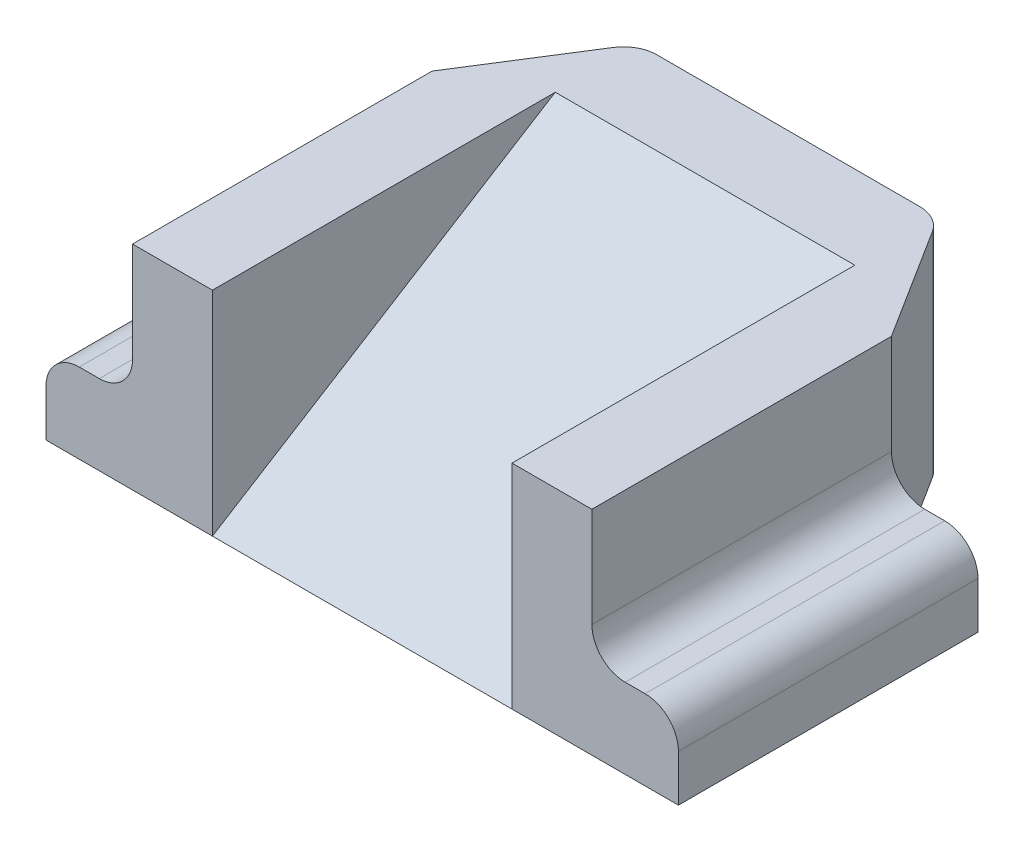
ISO-10303-21;
HEADER;
FILE_DESCRIPTION(('STEP AP214'),'2;1');
FILE_NAME('part.step','',(''),(''),'','','');
FILE_SCHEMA(('AUTOMOTIVE_DESIGN { 1 0 10303 214 1 1 1 1 }'));
ENDSEC;
DATA;
#1=APPLICATION_CONTEXT('core data for automotive mechanical design processes');
#2=APPLICATION_PROTOCOL_DEFINITION('international standard','automotive_design',2000,#1);
#3=PRODUCT_CONTEXT('',#1,'mechanical');
#4=PRODUCT('Part','Part','',(#3));
#5=PRODUCT_RELATED_PRODUCT_CATEGORY('part','',(#4));
#6=PRODUCT_DEFINITION_FORMATION('','',#4);
#7=PRODUCT_DEFINITION_CONTEXT('part definition',#1,'design');
#8=PRODUCT_DEFINITION('design','',#6,#7);
#9=PRODUCT_DEFINITION_SHAPE('','',#8);
#10=(LENGTH_UNIT() NAMED_UNIT(*) SI_UNIT(.MILLI.,.METRE.));
#11=(NAMED_UNIT(*) PLANE_ANGLE_UNIT() SI_UNIT($,.RADIAN.));
#12=(NAMED_UNIT(*) SI_UNIT($,.STERADIAN.) SOLID_ANGLE_UNIT());
#13=UNCERTAINTY_MEASURE_WITH_UNIT(LENGTH_MEASURE(1.E-05),#10,'distance_accuracy_value','');
#14=(GEOMETRIC_REPRESENTATION_CONTEXT(3) GLOBAL_UNCERTAINTY_ASSIGNED_CONTEXT((#13)) GLOBAL_UNIT_ASSIGNED_CONTEXT((#10,
#11,#12)) REPRESENTATION_CONTEXT('',''));
#15=CARTESIAN_POINT('',(0.,0.,0.));
#16=DIRECTION('',(0.,0.,1.));
#17=DIRECTION('',(1.,0.,0.));
#18=AXIS2_PLACEMENT_3D('',#15,#16,#17);
#19=CARTESIAN_POINT('',(26.,64.,-128.));
#20=DIRECTION('',(0.,-1.,0.));
#21=DIRECTION('',(0.,0.,-1.));
#22=AXIS2_PLACEMENT_3D('',#19,#20,#21);
#23=PLANE('',#22);
#24=DIRECTION('',(0.533992991387982,0.,0.845488903030971));
#25=VECTOR('',#24,1.);
#26=CARTESIAN_POINT('',(164.,64.,-90.));
#27=LINE('',#26,#25);
#28=CARTESIAN_POINT('',(142.943202159655,64.,-123.33992991388));
#29=VERTEX_POINT('',#28);
#30=CARTESIAN_POINT('',(164.,64.,-90.));
#31=VERTEX_POINT('',#30);
#32=EDGE_CURVE('E331',#29,#31,#27,.T.);
#33=ORIENTED_EDGE('',*,*,#32,.F.);
#34=CARTESIAN_POINT('',(134.488313129345,64.,-118.));
#35=DIRECTION('',(0.,-1.,0.));
#36=DIRECTION('',(0.,0.,-1.));
#37=AXIS2_PLACEMENT_3D('',#34,#35,#36);
#38=CIRCLE('',#37,10.);
#39=CARTESIAN_POINT('',(134.488313129345,64.,-128.));
#40=VERTEX_POINT('',#39);
#41=EDGE_CURVE('E233',#29,#40,#38,.F.);
#42=ORIENTED_EDGE('',*,*,#41,.T.);
#43=DIRECTION('',(1.,0.,0.));
#44=VECTOR('',#43,1.);
#45=CARTESIAN_POINT('',(26.,64.,-128.));
#46=LINE('',#45,#44);
#47=CARTESIAN_POINT('',(55.5116868706548,64.,-128.));
#48=VERTEX_POINT('',#47);
#49=EDGE_CURVE('E213',#48,#40,#46,.T.);
#50=ORIENTED_EDGE('',*,*,#49,.F.);
#51=CARTESIAN_POINT('',(55.5116868706548,64.,-118.));
#52=DIRECTION('',(0.,-1.,0.));
#53=DIRECTION('',(0.,0.,-1.));
#54=AXIS2_PLACEMENT_3D('',#51,#52,#53);
#55=CIRCLE('',#54,10.);
#56=CARTESIAN_POINT('',(47.0567978403451,64.,-123.33992991388));
#57=VERTEX_POINT('',#56);
#58=EDGE_CURVE('E231',#48,#57,#55,.F.);
#59=ORIENTED_EDGE('',*,*,#58,.T.);
#60=DIRECTION('',(0.533992991387981,0.,-0.845488903030971));
#61=VECTOR('',#60,1.);
#62=CARTESIAN_POINT('',(26.,64.,-90.));
#63=LINE('',#62,#61);
#64=CARTESIAN_POINT('',(26.,64.,-90.));
#65=VERTEX_POINT('',#64);
#66=EDGE_CURVE('E343',#65,#57,#63,.T.);
#67=ORIENTED_EDGE('',*,*,#66,.F.);
#68=DIRECTION('',(0.,0.,1.));
#69=VECTOR('',#68,1.);
#70=CARTESIAN_POINT('',(26.,64.,-128.));
#71=LINE('',#70,#69);
#72=CARTESIAN_POINT('',(26.,64.,0.));
#73=VERTEX_POINT('',#72);
#74=EDGE_CURVE('E191',#65,#73,#71,.T.);
#75=ORIENTED_EDGE('',*,*,#74,.T.);
#76=DIRECTION('',(1.,0.,0.));
#77=VECTOR('',#76,1.);
#78=CARTESIAN_POINT('',(26.,64.,0.));
#79=LINE('',#78,#77);
#80=CARTESIAN_POINT('',(50.,64.,0.));
#81=VERTEX_POINT('',#80);
#82=EDGE_CURVE('E181',#73,#81,#79,.T.);
#83=ORIENTED_EDGE('',*,*,#82,.T.);
#84=DIRECTION('',(0.,0.,-1.));
#85=VECTOR('',#84,1.);
#86=CARTESIAN_POINT('',(50.,64.,0.));
#87=LINE('',#86,#85);
#88=CARTESIAN_POINT('',(50.,64.,-103.));
#89=VERTEX_POINT('',#88);
#90=EDGE_CURVE('E163',#81,#89,#87,.T.);
#91=ORIENTED_EDGE('',*,*,#90,.T.);
#92=DIRECTION('',(1.,0.,0.));
#93=VECTOR('',#92,1.);
#94=CARTESIAN_POINT('',(50.,64.,-103.));
#95=LINE('',#94,#93);
#96=CARTESIAN_POINT('',(140.,64.,-103.));
#97=VERTEX_POINT('',#96);
#98=EDGE_CURVE('E334',#89,#97,#95,.T.);
#99=ORIENTED_EDGE('',*,*,#98,.T.);
#100=DIRECTION('',(0.,0.,1.));
#101=VECTOR('',#100,1.);
#102=CARTESIAN_POINT('',(140.,64.,-103.));
#103=LINE('',#102,#101);
#104=CARTESIAN_POINT('',(140.,64.,0.));
#105=VERTEX_POINT('',#104);
#106=EDGE_CURVE('E173',#97,#105,#103,.T.);
#107=ORIENTED_EDGE('',*,*,#106,.T.);
#108=CARTESIAN_POINT('',(164.,64.,0.));
#109=VERTEX_POINT('',#108);
#110=EDGE_CURVE('E193',#105,#109,#79,.T.);
#111=ORIENTED_EDGE('',*,*,#110,.T.);
#112=DIRECTION('',(0.,0.,1.));
#113=VECTOR('',#112,1.);
#114=CARTESIAN_POINT('',(164.,64.,-128.));
#115=LINE('',#114,#113);
#116=EDGE_CURVE('E221',#31,#109,#115,.T.);
#117=ORIENTED_EDGE('',*,*,#116,.F.);
#118=EDGE_LOOP('',(#33,#42,#50,#59,#67,#75,#83,#91,#99,#107,#111,#117));
#119=FACE_BOUND('',#118,.T.);
#120=ADVANCED_FACE('F33',(#119),#23,.F.);
#121=CARTESIAN_POINT('',(0.,0.,0.));
#122=DIRECTION('',(0.,0.,-1.));
#123=DIRECTION('',(-1.,0.,0.));
#124=AXIS2_PLACEMENT_3D('',#121,#122,#123);
#125=PLANE('',#124);
#126=DIRECTION('',(0.,-1.,0.));
#127=VECTOR('',#126,1.);
#128=CARTESIAN_POINT('',(190.,24.,0.));
#129=LINE('',#128,#127);
#130=CARTESIAN_POINT('',(190.,14.,0.));
#131=VERTEX_POINT('',#130);
#132=CARTESIAN_POINT('',(190.,0.,0.));
#133=VERTEX_POINT('',#132);
#134=EDGE_CURVE('E204',#131,#133,#129,.T.);
#135=ORIENTED_EDGE('',*,*,#134,.F.);
#136=CARTESIAN_POINT('',(180.,14.,0.));
#137=DIRECTION('',(0.,0.,-1.));
#138=DIRECTION('',(-1.,0.,0.));
#139=AXIS2_PLACEMENT_3D('',#136,#137,#138);
#140=CIRCLE('',#139,10.);
#141=CARTESIAN_POINT('',(180.,24.,0.));
#142=VERTEX_POINT('',#141);
#143=EDGE_CURVE('E271',#131,#142,#140,.F.);
#144=ORIENTED_EDGE('',*,*,#143,.T.);
#145=DIRECTION('',(-1.,0.,0.));
#146=VECTOR('',#145,1.);
#147=CARTESIAN_POINT('',(190.,24.,0.));
#148=LINE('',#147,#146);
#149=CARTESIAN_POINT('',(174.,24.,0.));
#150=VERTEX_POINT('',#149);
#151=EDGE_CURVE('E195',#142,#150,#148,.T.);
#152=ORIENTED_EDGE('',*,*,#151,.T.);
#153=CARTESIAN_POINT('',(174.,34.,0.));
#154=DIRECTION('',(0.,0.,-1.));
#155=DIRECTION('',(-1.,0.,0.));
#156=AXIS2_PLACEMENT_3D('',#153,#154,#155);
#157=CIRCLE('',#156,10.);
#158=CARTESIAN_POINT('',(164.,34.,0.));
#159=VERTEX_POINT('',#158);
#160=EDGE_CURVE('E42',#150,#159,#157,.T.);
#161=ORIENTED_EDGE('',*,*,#160,.T.);
#162=DIRECTION('',(0.,1.,0.));
#163=VECTOR('',#162,1.);
#164=CARTESIAN_POINT('',(164.,24.,0.));
#165=LINE('',#164,#163);
#166=EDGE_CURVE('E192',#159,#109,#165,.T.);
#167=ORIENTED_EDGE('',*,*,#166,.T.);
#168=ORIENTED_EDGE('',*,*,#110,.F.);
#169=DIRECTION('',(0.,1.,0.));
#170=VECTOR('',#169,1.);
#171=CARTESIAN_POINT('',(140.,-116.907978850755,0.));
#172=LINE('',#171,#170);
#173=CARTESIAN_POINT('',(140.,0.,0.));
#174=VERTEX_POINT('',#173);
#175=EDGE_CURVE('E185',#174,#105,#172,.T.);
#176=ORIENTED_EDGE('',*,*,#175,.F.);
#177=DIRECTION('',(1.,0.,0.));
#178=VECTOR('',#177,1.);
#179=CARTESIAN_POINT('',(0.,0.,0.));
#180=LINE('',#179,#178);
#181=EDGE_CURVE('E206',#174,#133,#180,.T.);
#182=ORIENTED_EDGE('',*,*,#181,.T.);
#183=EDGE_LOOP('',(#135,#144,#152,#161,#167,#168,#176,#182));
#184=FACE_BOUND('',#183,.T.);
#185=ADVANCED_FACE('F282',(#184),#125,.F.);
#186=DIRECTION('',(1.,0.,0.));
#187=VECTOR('',#186,1.);
#188=CARTESIAN_POINT('',(0.,24.,0.));
#189=LINE('',#188,#187);
#190=CARTESIAN_POINT('',(10.,24.,0.));
#191=VERTEX_POINT('',#190);
#192=CARTESIAN_POINT('',(16.,24.,0.));
#193=VERTEX_POINT('',#192);
#194=EDGE_CURVE('E210',#191,#193,#189,.T.);
#195=ORIENTED_EDGE('',*,*,#194,.F.);
#196=CARTESIAN_POINT('',(10.,14.,0.));
#197=DIRECTION('',(0.,0.,-1.));
#198=DIRECTION('',(-1.,0.,0.));
#199=AXIS2_PLACEMENT_3D('',#196,#197,#198);
#200=CIRCLE('',#199,10.);
#201=CARTESIAN_POINT('',(0.,14.,0.));
#202=VERTEX_POINT('',#201);
#203=EDGE_CURVE('E254',#191,#202,#200,.F.);
#204=ORIENTED_EDGE('',*,*,#203,.T.);
#205=DIRECTION('',(0.,-1.,0.));
#206=VECTOR('',#205,1.);
#207=CARTESIAN_POINT('',(0.,24.,0.));
#208=LINE('',#207,#206);
#209=CARTESIAN_POINT('',(0.,0.,0.));
#210=VERTEX_POINT('',#209);
#211=EDGE_CURVE('E208',#202,#210,#208,.T.);
#212=ORIENTED_EDGE('',*,*,#211,.T.);
#213=CARTESIAN_POINT('',(50.,0.,0.));
#214=VERTEX_POINT('',#213);
#215=EDGE_CURVE('E183',#210,#214,#180,.T.);
#216=ORIENTED_EDGE('',*,*,#215,.T.);
#217=DIRECTION('',(0.,1.,0.));
#218=VECTOR('',#217,1.);
#219=CARTESIAN_POINT('',(50.,-116.907978850755,0.));
#220=LINE('',#219,#218);
#221=EDGE_CURVE('E166',#214,#81,#220,.T.);
#222=ORIENTED_EDGE('',*,*,#221,.T.);
#223=ORIENTED_EDGE('',*,*,#82,.F.);
#224=DIRECTION('',(0.,1.,0.));
#225=VECTOR('',#224,1.);
#226=CARTESIAN_POINT('',(26.,24.,0.));
#227=LINE('',#226,#225);
#228=CARTESIAN_POINT('',(26.,34.,0.));
#229=VERTEX_POINT('',#228);
#230=EDGE_CURVE('E198',#229,#73,#227,.T.);
#231=ORIENTED_EDGE('',*,*,#230,.F.);
#232=CARTESIAN_POINT('',(16.,34.,0.));
#233=DIRECTION('',(0.,0.,-1.));
#234=DIRECTION('',(-1.,0.,0.));
#235=AXIS2_PLACEMENT_3D('',#232,#233,#234);
#236=CIRCLE('',#235,10.);
#237=EDGE_CURVE('E275',#229,#193,#236,.T.);
#238=ORIENTED_EDGE('',*,*,#237,.T.);
#239=EDGE_LOOP('',(#195,#204,#212,#216,#222,#223,#231,#238));
#240=FACE_BOUND('',#239,.T.);
#241=ADVANCED_FACE('F179',(#240),#125,.F.);
#242=CARTESIAN_POINT('',(26.,24.,-128.));
#243=DIRECTION('',(1.,0.,0.));
#244=DIRECTION('',(0.,0.,-1.));
#245=AXIS2_PLACEMENT_3D('',#242,#243,#244);
#246=PLANE('',#245);
#247=DIRECTION('',(0.,1.,0.));
#248=VECTOR('',#247,1.);
#249=CARTESIAN_POINT('',(26.,0.,-90.));
#250=LINE('',#249,#248);
#251=CARTESIAN_POINT('',(26.,34.,-90.));
#252=VERTEX_POINT('',#251);
#253=EDGE_CURVE('E308',#252,#65,#250,.T.);
#254=ORIENTED_EDGE('',*,*,#253,.F.);
#255=DIRECTION('',(0.,0.,1.));
#256=VECTOR('',#255,1.);
#257=CARTESIAN_POINT('',(26.,34.,0.));
#258=LINE('',#257,#256);
#259=EDGE_CURVE('E246',#252,#229,#258,.T.);
#260=ORIENTED_EDGE('',*,*,#259,.T.);
#261=ORIENTED_EDGE('',*,*,#230,.T.);
#262=ORIENTED_EDGE('',*,*,#74,.F.);
#263=EDGE_LOOP('',(#254,#260,#261,#262));
#264=FACE_BOUND('',#263,.T.);
#265=ADVANCED_FACE('F379',(#264),#246,.F.);
#266=CARTESIAN_POINT('',(164.,24.,-128.));
#267=DIRECTION('',(1.,0.,0.));
#268=DIRECTION('',(0.,0.,-1.));
#269=AXIS2_PLACEMENT_3D('',#266,#267,#268);
#270=PLANE('',#269);
#271=ORIENTED_EDGE('',*,*,#166,.F.);
#272=DIRECTION('',(0.,0.,1.));
#273=VECTOR('',#272,1.);
#274=CARTESIAN_POINT('',(164.,34.,-90.));
#275=LINE('',#274,#273);
#276=CARTESIAN_POINT('',(164.,34.,-90.));
#277=VERTEX_POINT('',#276);
#278=EDGE_CURVE('E265',#159,#277,#275,.F.);
#279=ORIENTED_EDGE('',*,*,#278,.T.);
#280=DIRECTION('',(0.,1.,0.));
#281=VECTOR('',#280,1.);
#282=CARTESIAN_POINT('',(164.,0.,-90.));
#283=LINE('',#282,#281);
#284=EDGE_CURVE('E350',#277,#31,#283,.T.);
#285=ORIENTED_EDGE('',*,*,#284,.T.);
#286=ORIENTED_EDGE('',*,*,#116,.T.);
#287=EDGE_LOOP('',(#271,#279,#285,#286));
#288=FACE_BOUND('',#287,.T.);
#289=ADVANCED_FACE('F289',(#288),#270,.T.);
#290=CARTESIAN_POINT('',(190.,24.,-128.));
#291=DIRECTION('',(0.,1.,0.));
#292=DIRECTION('',(-1.,0.,0.));
#293=AXIS2_PLACEMENT_3D('',#290,#291,#292);
#294=PLANE('',#293);
#295=DIRECTION('',(1.,0.,0.));
#296=VECTOR('',#295,1.);
#297=CARTESIAN_POINT('',(190.,24.,-90.));
#298=LINE('',#297,#296);
#299=CARTESIAN_POINT('',(174.,24.,-90.));
#300=VERTEX_POINT('',#299);
#301=CARTESIAN_POINT('',(180.,24.,-90.));
#302=VERTEX_POINT('',#301);
#303=EDGE_CURVE('E299',#300,#302,#298,.T.);
#304=ORIENTED_EDGE('',*,*,#303,.F.);
#305=DIRECTION('',(0.,0.,1.));
#306=VECTOR('',#305,1.);
#307=CARTESIAN_POINT('',(174.,24.,0.));
#308=LINE('',#307,#306);
#309=EDGE_CURVE('E262',#300,#150,#308,.T.);
#310=ORIENTED_EDGE('',*,*,#309,.T.);
#311=ORIENTED_EDGE('',*,*,#151,.F.);
#312=DIRECTION('',(0.,0.,1.));
#313=VECTOR('',#312,1.);
#314=CARTESIAN_POINT('',(180.,24.,-90.));
#315=LINE('',#314,#313);
#316=EDGE_CURVE('E260',#142,#302,#315,.F.);
#317=ORIENTED_EDGE('',*,*,#316,.T.);
#318=EDGE_LOOP('',(#304,#310,#311,#317));
#319=FACE_BOUND('',#318,.T.);
#320=ADVANCED_FACE('F305',(#319),#294,.T.);
#321=CARTESIAN_POINT('',(190.,24.,-128.));
#322=DIRECTION('',(-1.,0.,0.));
#323=DIRECTION('',(0.,0.,1.));
#324=AXIS2_PLACEMENT_3D('',#321,#322,#323);
#325=PLANE('',#324);
#326=DIRECTION('',(0.,1.,0.));
#327=VECTOR('',#326,1.);
#328=CARTESIAN_POINT('',(190.,0.,-90.));
#329=LINE('',#328,#327);
#330=CARTESIAN_POINT('',(190.,0.,-90.));
#331=VERTEX_POINT('',#330);
#332=CARTESIAN_POINT('',(190.,14.,-90.));
#333=VERTEX_POINT('',#332);
#334=EDGE_CURVE('E341',#331,#333,#329,.T.);
#335=ORIENTED_EDGE('',*,*,#334,.T.);
#336=DIRECTION('',(0.,0.,1.));
#337=VECTOR('',#336,1.);
#338=CARTESIAN_POINT('',(190.,14.,0.));
#339=LINE('',#338,#337);
#340=EDGE_CURVE('E268',#333,#131,#339,.T.);
#341=ORIENTED_EDGE('',*,*,#340,.T.);
#342=ORIENTED_EDGE('',*,*,#134,.T.);
#343=DIRECTION('',(0.,0.,1.));
#344=VECTOR('',#343,1.);
#345=CARTESIAN_POINT('',(190.,0.,-128.));
#346=LINE('',#345,#344);
#347=EDGE_CURVE('E217',#331,#133,#346,.T.);
#348=ORIENTED_EDGE('',*,*,#347,.F.);
#349=EDGE_LOOP('',(#335,#341,#342,#348));
#350=FACE_BOUND('',#349,.T.);
#351=ADVANCED_FACE('F353',(#350),#325,.F.);
#352=CARTESIAN_POINT('',(0.,0.,-128.));
#353=DIRECTION('',(0.,-1.,0.));
#354=DIRECTION('',(0.,0.,-1.));
#355=AXIS2_PLACEMENT_3D('',#352,#353,#354);
#356=PLANE('',#355);
#357=DIRECTION('',(1.,0.,0.));
#358=VECTOR('',#357,1.);
#359=CARTESIAN_POINT('',(0.,0.,-128.));
#360=LINE('',#359,#358);
#361=CARTESIAN_POINT('',(55.5116868706548,0.,-128.));
#362=VERTEX_POINT('',#361);
#363=CARTESIAN_POINT('',(134.488313129345,0.,-128.));
#364=VERTEX_POINT('',#363);
#365=EDGE_CURVE('E218',#362,#364,#360,.T.);
#366=ORIENTED_EDGE('',*,*,#365,.T.);
#367=CARTESIAN_POINT('',(134.488313129345,0.,-118.));
#368=DIRECTION('',(0.,-1.,0.));
#369=DIRECTION('',(0.,0.,-1.));
#370=AXIS2_PLACEMENT_3D('',#367,#368,#369);
#371=CIRCLE('',#370,10.);
#372=CARTESIAN_POINT('',(142.943202159655,0.,-123.33992991388));
#373=VERTEX_POINT('',#372);
#374=EDGE_CURVE('E242',#364,#373,#371,.T.);
#375=ORIENTED_EDGE('',*,*,#374,.T.);
#376=DIRECTION('',(0.533992991387982,0.,0.845488903030971));
#377=VECTOR('',#376,1.);
#378=CARTESIAN_POINT('',(164.,0.,-90.));
#379=LINE('',#378,#377);
#380=CARTESIAN_POINT('',(164.,0.,-90.));
#381=VERTEX_POINT('',#380);
#382=EDGE_CURVE('E332',#373,#381,#379,.T.);
#383=ORIENTED_EDGE('',*,*,#382,.T.);
#384=DIRECTION('',(1.,0.,0.));
#385=VECTOR('',#384,1.);
#386=CARTESIAN_POINT('',(164.,0.,-90.));
#387=LINE('',#386,#385);
#388=EDGE_CURVE('E336',#381,#331,#387,.T.);
#389=ORIENTED_EDGE('',*,*,#388,.T.);
#390=ORIENTED_EDGE('',*,*,#347,.T.);
#391=ORIENTED_EDGE('',*,*,#181,.F.);
#392=DIRECTION('',(1.,0.,0.));
#393=VECTOR('',#392,1.);
#394=CARTESIAN_POINT('',(140.,0.,0.));
#395=LINE('',#394,#393);
#396=EDGE_CURVE('E338',#214,#174,#395,.T.);
#397=ORIENTED_EDGE('',*,*,#396,.F.);
#398=ORIENTED_EDGE('',*,*,#215,.F.);
#399=DIRECTION('',(0.,0.,1.));
#400=VECTOR('',#399,1.);
#401=CARTESIAN_POINT('',(0.,0.,-128.));
#402=LINE('',#401,#400);
#403=CARTESIAN_POINT('',(0.,0.,-90.));
#404=VERTEX_POINT('',#403);
#405=EDGE_CURVE('E214',#404,#210,#402,.T.);
#406=ORIENTED_EDGE('',*,*,#405,.F.);
#407=DIRECTION('',(1.,0.,0.));
#408=VECTOR('',#407,1.);
#409=CARTESIAN_POINT('',(0.,0.,-90.));
#410=LINE('',#409,#408);
#411=CARTESIAN_POINT('',(26.,0.,-90.));
#412=VERTEX_POINT('',#411);
#413=EDGE_CURVE('E348',#404,#412,#410,.T.);
#414=ORIENTED_EDGE('',*,*,#413,.T.);
#415=DIRECTION('',(0.533992991387981,0.,-0.845488903030971));
#416=VECTOR('',#415,1.);
#417=CARTESIAN_POINT('',(26.,0.,-90.));
#418=LINE('',#417,#416);
#419=CARTESIAN_POINT('',(47.0567978403451,0.,-123.33992991388));
#420=VERTEX_POINT('',#419);
#421=EDGE_CURVE('E369',#412,#420,#418,.T.);
#422=ORIENTED_EDGE('',*,*,#421,.T.);
#423=CARTESIAN_POINT('',(55.5116868706548,0.,-118.));
#424=DIRECTION('',(0.,-1.,0.));
#425=DIRECTION('',(0.,0.,-1.));
#426=AXIS2_PLACEMENT_3D('',#423,#424,#425);
#427=CIRCLE('',#426,10.);
#428=EDGE_CURVE('E240',#420,#362,#427,.T.);
#429=ORIENTED_EDGE('',*,*,#428,.T.);
#430=EDGE_LOOP('',(#366,#375,#383,#389,#390,#391,#397,#398,#406,#414,#422,#429));
#431=FACE_BOUND('',#430,.T.);
#432=ADVANCED_FACE('F318',(#431),#356,.T.);
#433=CARTESIAN_POINT('',(0.,24.,-128.));
#434=DIRECTION('',(-1.,0.,0.));
#435=DIRECTION('',(0.,-1.,0.));
#436=AXIS2_PLACEMENT_3D('',#433,#434,#435);
#437=PLANE('',#436);
#438=ORIENTED_EDGE('',*,*,#211,.F.);
#439=DIRECTION('',(0.,0.,1.));
#440=VECTOR('',#439,1.);
#441=CARTESIAN_POINT('',(0.,14.,-90.));
#442=LINE('',#441,#440);
#443=CARTESIAN_POINT('',(0.,14.,-90.));
#444=VERTEX_POINT('',#443);
#445=EDGE_CURVE('E256',#202,#444,#442,.F.);
#446=ORIENTED_EDGE('',*,*,#445,.T.);
#447=DIRECTION('',(0.,1.,0.));
#448=VECTOR('',#447,1.);
#449=CARTESIAN_POINT('',(0.,0.,-90.));
#450=LINE('',#449,#448);
#451=EDGE_CURVE('E370',#404,#444,#450,.T.);
#452=ORIENTED_EDGE('',*,*,#451,.F.);
#453=ORIENTED_EDGE('',*,*,#405,.T.);
#454=EDGE_LOOP('',(#438,#446,#452,#453));
#455=FACE_BOUND('',#454,.T.);
#456=ADVANCED_FACE('F395',(#455),#437,.T.);
#457=CARTESIAN_POINT('',(0.,24.,-128.));
#458=DIRECTION('',(0.,-1.,0.));
#459=DIRECTION('',(0.,0.,-1.));
#460=AXIS2_PLACEMENT_3D('',#457,#458,#459);
#461=PLANE('',#460);
#462=ORIENTED_EDGE('',*,*,#194,.T.);
#463=DIRECTION('',(0.,0.,1.));
#464=VECTOR('',#463,1.);
#465=CARTESIAN_POINT('',(16.,24.,-90.));
#466=LINE('',#465,#464);
#467=CARTESIAN_POINT('',(16.,24.,-90.));
#468=VERTEX_POINT('',#467);
#469=EDGE_CURVE('E252',#193,#468,#466,.F.);
#470=ORIENTED_EDGE('',*,*,#469,.T.);
#471=DIRECTION('',(-1.,0.,0.));
#472=VECTOR('',#471,1.);
#473=CARTESIAN_POINT('',(0.,24.,-90.));
#474=LINE('',#473,#472);
#475=CARTESIAN_POINT('',(10.,24.,-90.));
#476=VERTEX_POINT('',#475);
#477=EDGE_CURVE('E225',#468,#476,#474,.T.);
#478=ORIENTED_EDGE('',*,*,#477,.T.);
#479=DIRECTION('',(0.,0.,1.));
#480=VECTOR('',#479,1.);
#481=CARTESIAN_POINT('',(10.,24.,0.));
#482=LINE('',#481,#480);
#483=EDGE_CURVE('E249',#476,#191,#482,.T.);
#484=ORIENTED_EDGE('',*,*,#483,.T.);
#485=EDGE_LOOP('',(#462,#470,#478,#484));
#486=FACE_BOUND('',#485,.T.);
#487=ADVANCED_FACE('F384',(#486),#461,.F.);
#488=CARTESIAN_POINT('',(0.,0.,-128.));
#489=DIRECTION('',(0.,0.,-1.));
#490=DIRECTION('',(-1.,0.,0.));
#491=AXIS2_PLACEMENT_3D('',#488,#489,#490);
#492=PLANE('',#491);
#493=ORIENTED_EDGE('',*,*,#49,.T.);
#494=DIRECTION('',(0.,1.,0.));
#495=VECTOR('',#494,1.);
#496=CARTESIAN_POINT('',(134.488313129345,0.,-128.));
#497=LINE('',#496,#495);
#498=EDGE_CURVE('E238',#40,#364,#497,.F.);
#499=ORIENTED_EDGE('',*,*,#498,.T.);
#500=ORIENTED_EDGE('',*,*,#365,.F.);
#501=DIRECTION('',(0.,1.,0.));
#502=VECTOR('',#501,1.);
#503=CARTESIAN_POINT('',(55.5116868706548,64.,-128.));
#504=LINE('',#503,#502);
#505=EDGE_CURVE('E235',#362,#48,#504,.T.);
#506=ORIENTED_EDGE('',*,*,#505,.T.);
#507=EDGE_LOOP('',(#493,#499,#500,#506));
#508=FACE_BOUND('',#507,.T.);
#509=ADVANCED_FACE('F398',(#508),#492,.T.);
#510=CARTESIAN_POINT('',(164.,0.,-90.));
#511=DIRECTION('',(0.,0.,1.));
#512=DIRECTION('',(1.,0.,0.));
#513=AXIS2_PLACEMENT_3D('',#510,#511,#512);
#514=PLANE('',#513);
#515=ORIENTED_EDGE('',*,*,#303,.T.);
#516=CARTESIAN_POINT('',(180.,14.,-90.));
#517=DIRECTION('',(0.,0.,1.));
#518=DIRECTION('',(1.,0.,0.));
#519=AXIS2_PLACEMENT_3D('',#516,#517,#518);
#520=CIRCLE('',#519,10.);
#521=EDGE_CURVE('E273',#302,#333,#520,.F.);
#522=ORIENTED_EDGE('',*,*,#521,.T.);
#523=ORIENTED_EDGE('',*,*,#334,.F.);
#524=ORIENTED_EDGE('',*,*,#388,.F.);
#525=EDGE_CURVE('E303',#381,#277,#283,.T.);
#526=ORIENTED_EDGE('',*,*,#525,.T.);
#527=CARTESIAN_POINT('',(174.,34.,-90.));
#528=DIRECTION('',(0.,0.,1.));
#529=DIRECTION('',(1.,0.,0.));
#530=AXIS2_PLACEMENT_3D('',#527,#528,#529);
#531=CIRCLE('',#530,10.);
#532=EDGE_CURVE('E11',#277,#300,#531,.T.);
#533=ORIENTED_EDGE('',*,*,#532,.T.);
#534=EDGE_LOOP('',(#515,#522,#523,#524,#526,#533));
#535=FACE_BOUND('',#534,.T.);
#536=ADVANCED_FACE('F298',(#535),#514,.F.);
#537=CARTESIAN_POINT('',(164.,0.,-90.));
#538=DIRECTION('',(-0.845488903030971,0.,0.533992991387982));
#539=DIRECTION('',(0.533992991387982,0.,0.845488903030971));
#540=AXIS2_PLACEMENT_3D('',#537,#538,#539);
#541=PLANE('',#540);
#542=ORIENTED_EDGE('',*,*,#382,.F.);
#543=DIRECTION('',(0.,1.,0.));
#544=VECTOR('',#543,1.);
#545=CARTESIAN_POINT('',(142.943202159655,64.,-123.33992991388));
#546=LINE('',#545,#544);
#547=EDGE_CURVE('E228',#373,#29,#546,.T.);
#548=ORIENTED_EDGE('',*,*,#547,.T.);
#549=ORIENTED_EDGE('',*,*,#32,.T.);
#550=ORIENTED_EDGE('',*,*,#284,.F.);
#551=ORIENTED_EDGE('',*,*,#525,.F.);
#552=EDGE_LOOP('',(#542,#548,#549,#550,#551));
#553=FACE_BOUND('',#552,.T.);
#554=ADVANCED_FACE('F330',(#553),#541,.F.);
#555=CARTESIAN_POINT('',(0.,0.,-90.));
#556=DIRECTION('',(0.,0.,1.));
#557=DIRECTION('',(1.,0.,0.));
#558=AXIS2_PLACEMENT_3D('',#555,#556,#557);
#559=PLANE('',#558);
#560=ORIENTED_EDGE('',*,*,#451,.T.);
#561=CARTESIAN_POINT('',(10.,14.,-90.));
#562=DIRECTION('',(0.,0.,1.));
#563=DIRECTION('',(1.,0.,0.));
#564=AXIS2_PLACEMENT_3D('',#561,#562,#563);
#565=CIRCLE('',#564,10.);
#566=EDGE_CURVE('E258',#444,#476,#565,.F.);
#567=ORIENTED_EDGE('',*,*,#566,.T.);
#568=ORIENTED_EDGE('',*,*,#477,.F.);
#569=CARTESIAN_POINT('',(16.,34.,-90.));
#570=DIRECTION('',(0.,0.,1.));
#571=DIRECTION('',(1.,0.,0.));
#572=AXIS2_PLACEMENT_3D('',#569,#570,#571);
#573=CIRCLE('',#572,10.);
#574=EDGE_CURVE('E277',#468,#252,#573,.T.);
#575=ORIENTED_EDGE('',*,*,#574,.T.);
#576=EDGE_CURVE('E49',#412,#252,#250,.T.);
#577=ORIENTED_EDGE('',*,*,#576,.F.);
#578=ORIENTED_EDGE('',*,*,#413,.F.);
#579=EDGE_LOOP('',(#560,#567,#568,#575,#577,#578));
#580=FACE_BOUND('',#579,.T.);
#581=ADVANCED_FACE('F389',(#580),#559,.F.);
#582=CARTESIAN_POINT('',(26.,0.,-90.));
#583=DIRECTION('',(0.845488903030971,0.,0.533992991387981));
#584=DIRECTION('',(0.533992991387981,0.,-0.845488903030971));
#585=AXIS2_PLACEMENT_3D('',#582,#583,#584);
#586=PLANE('',#585);
#587=ORIENTED_EDGE('',*,*,#66,.T.);
#588=DIRECTION('',(0.,1.,0.));
#589=VECTOR('',#588,1.);
#590=CARTESIAN_POINT('',(47.0567978403451,0.,-123.33992991388));
#591=LINE('',#590,#589);
#592=EDGE_CURVE('E244',#57,#420,#591,.F.);
#593=ORIENTED_EDGE('',*,*,#592,.T.);
#594=ORIENTED_EDGE('',*,*,#421,.F.);
#595=ORIENTED_EDGE('',*,*,#576,.T.);
#596=ORIENTED_EDGE('',*,*,#253,.T.);
#597=EDGE_LOOP('',(#587,#593,#594,#595,#596));
#598=FACE_BOUND('',#597,.T.);
#599=ADVANCED_FACE('F376',(#598),#586,.F.);
#600=CARTESIAN_POINT('',(140.,-116.907978850755,-103.));
#601=DIRECTION('',(-1.,0.,0.));
#602=DIRECTION('',(0.,0.,1.));
#603=AXIS2_PLACEMENT_3D('',#600,#601,#602);
#604=PLANE('',#603);
#605=ORIENTED_EDGE('',*,*,#175,.T.);
#606=ORIENTED_EDGE('',*,*,#106,.F.);
#607=DIRECTION('',(0.,0.527773353517171,-0.849385240816698));
#608=VECTOR('',#607,1.);
#609=CARTESIAN_POINT('',(140.,13.6090390089975,-21.9020471551054));
#610=LINE('',#609,#608);
#611=EDGE_CURVE('E184',#174,#97,#610,.T.);
#612=ORIENTED_EDGE('',*,*,#611,.F.);
#613=EDGE_LOOP('',(#605,#606,#612));
#614=FACE_BOUND('',#613,.T.);
#615=ADVANCED_FACE('F473',(#614),#604,.T.);
#616=CARTESIAN_POINT('',(50.,-116.907978850755,0.));
#617=DIRECTION('',(1.,0.,0.));
#618=DIRECTION('',(0.,0.,-1.));
#619=AXIS2_PLACEMENT_3D('',#616,#617,#618);
#620=PLANE('',#619);
#621=ORIENTED_EDGE('',*,*,#90,.F.);
#622=ORIENTED_EDGE('',*,*,#221,.F.);
#623=DIRECTION('',(0.,-0.527773353517171,0.849385240816698));
#624=VECTOR('',#623,1.);
#625=CARTESIAN_POINT('',(50.,-32.5640993793058,52.4078474385702));
#626=LINE('',#625,#624);
#627=EDGE_CURVE('E168',#89,#214,#626,.T.);
#628=ORIENTED_EDGE('',*,*,#627,.F.);
#629=EDGE_LOOP('',(#621,#622,#628));
#630=FACE_BOUND('',#629,.T.);
#631=ADVANCED_FACE('F165',(#630),#620,.T.);
#632=CARTESIAN_POINT('',(0.,0.,0.));
#633=DIRECTION('',(0.,0.849385240816698,0.527773353517171));
#634=DIRECTION('',(0.,-0.527773353517171,0.849385240816698));
#635=AXIS2_PLACEMENT_3D('',#632,#633,#634);
#636=PLANE('',#635);
#637=ORIENTED_EDGE('',*,*,#98,.F.);
#638=ORIENTED_EDGE('',*,*,#627,.T.);
#639=ORIENTED_EDGE('',*,*,#396,.T.);
#640=ORIENTED_EDGE('',*,*,#611,.T.);
#641=EDGE_LOOP('',(#637,#638,#639,#640));
#642=FACE_BOUND('',#641,.T.);
#643=ADVANCED_FACE('F421',(#642),#636,.T.);
#644=CARTESIAN_POINT('',(134.488313129345,0.,-118.));
#645=DIRECTION('',(0.,-1.,0.));
#646=DIRECTION('',(0.,0.,-1.));
#647=AXIS2_PLACEMENT_3D('',#644,#645,#646);
#648=CYLINDRICAL_SURFACE('',#647,10.);
#649=ORIENTED_EDGE('',*,*,#374,.F.);
#650=ORIENTED_EDGE('',*,*,#498,.F.);
#651=ORIENTED_EDGE('',*,*,#41,.F.);
#652=ORIENTED_EDGE('',*,*,#547,.F.);
#653=EDGE_LOOP('',(#649,#650,#651,#652));
#654=FACE_BOUND('',#653,.T.);
#655=ADVANCED_FACE('F327',(#654),#648,.T.);
#656=CARTESIAN_POINT('',(55.5116868706548,0.,-118.));
#657=DIRECTION('',(0.,-1.,0.));
#658=DIRECTION('',(0.,0.,-1.));
#659=AXIS2_PLACEMENT_3D('',#656,#657,#658);
#660=CYLINDRICAL_SURFACE('',#659,10.);
#661=ORIENTED_EDGE('',*,*,#428,.F.);
#662=ORIENTED_EDGE('',*,*,#592,.F.);
#663=ORIENTED_EDGE('',*,*,#58,.F.);
#664=ORIENTED_EDGE('',*,*,#505,.F.);
#665=EDGE_LOOP('',(#661,#662,#663,#664));
#666=FACE_BOUND('',#665,.T.);
#667=ADVANCED_FACE('F397',(#666),#660,.T.);
#668=CARTESIAN_POINT('',(16.,34.,-128.));
#669=DIRECTION('',(0.,0.,-1.));
#670=DIRECTION('',(-1.,0.,0.));
#671=AXIS2_PLACEMENT_3D('',#668,#669,#670);
#672=CYLINDRICAL_SURFACE('',#671,10.);
#673=ORIENTED_EDGE('',*,*,#574,.F.);
#674=ORIENTED_EDGE('',*,*,#469,.F.);
#675=ORIENTED_EDGE('',*,*,#237,.F.);
#676=ORIENTED_EDGE('',*,*,#259,.F.);
#677=EDGE_LOOP('',(#673,#674,#675,#676));
#678=FACE_BOUND('',#677,.T.);
#679=ADVANCED_FACE('F388',(#678),#672,.F.);
#680=CARTESIAN_POINT('',(10.,14.,-128.));
#681=DIRECTION('',(0.,0.,-1.));
#682=DIRECTION('',(-1.,0.,0.));
#683=AXIS2_PLACEMENT_3D('',#680,#681,#682);
#684=CYLINDRICAL_SURFACE('',#683,10.);
#685=ORIENTED_EDGE('',*,*,#566,.F.);
#686=ORIENTED_EDGE('',*,*,#445,.F.);
#687=ORIENTED_EDGE('',*,*,#203,.F.);
#688=ORIENTED_EDGE('',*,*,#483,.F.);
#689=EDGE_LOOP('',(#685,#686,#687,#688));
#690=FACE_BOUND('',#689,.T.);
#691=ADVANCED_FACE('F391',(#690),#684,.T.);
#692=CARTESIAN_POINT('',(174.,34.,-128.));
#693=DIRECTION('',(0.,0.,-1.));
#694=DIRECTION('',(-1.,0.,0.));
#695=AXIS2_PLACEMENT_3D('',#692,#693,#694);
#696=CYLINDRICAL_SURFACE('',#695,10.);
#697=ORIENTED_EDGE('',*,*,#532,.F.);
#698=ORIENTED_EDGE('',*,*,#278,.F.);
#699=ORIENTED_EDGE('',*,*,#160,.F.);
#700=ORIENTED_EDGE('',*,*,#309,.F.);
#701=EDGE_LOOP('',(#697,#698,#699,#700));
#702=FACE_BOUND('',#701,.T.);
#703=ADVANCED_FACE('F293',(#702),#696,.F.);
#704=CARTESIAN_POINT('',(180.,14.,-128.));
#705=DIRECTION('',(0.,0.,-1.));
#706=DIRECTION('',(-1.,0.,0.));
#707=AXIS2_PLACEMENT_3D('',#704,#705,#706);
#708=CYLINDRICAL_SURFACE('',#707,10.);
#709=ORIENTED_EDGE('',*,*,#521,.F.);
#710=ORIENTED_EDGE('',*,*,#316,.F.);
#711=ORIENTED_EDGE('',*,*,#143,.F.);
#712=ORIENTED_EDGE('',*,*,#340,.F.);
#713=EDGE_LOOP('',(#709,#710,#711,#712));
#714=FACE_BOUND('',#713,.T.);
#715=ADVANCED_FACE('F35',(#714),#708,.T.);
#716=CLOSED_SHELL('',(#120,#185,#241,#265,#289,#320,#351,#432,#456,#487,#509,#536,#554,#581,
#599,#615,#631,#643,#655,#667,#679,#691,#703,#715));
#717=MANIFOLD_SOLID_BREP('B2',#716);
#718=ADVANCED_BREP_SHAPE_REPRESENTATION('',(#18,#717),#14);
#719=SHAPE_DEFINITION_REPRESENTATION(#9,#718);
ENDSEC;
END-ISO-10303-21;
